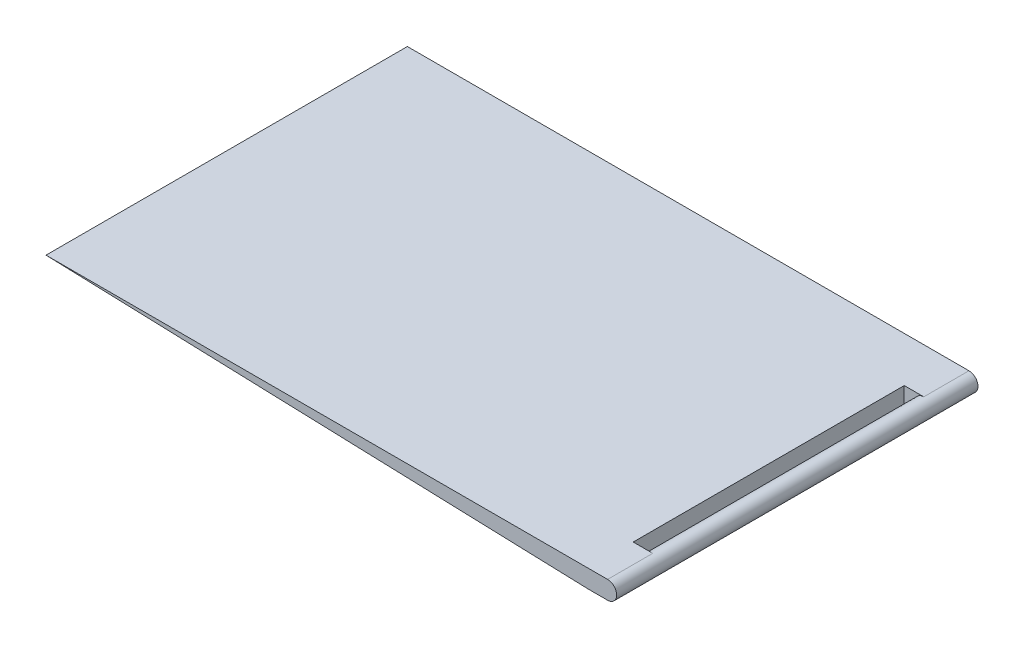
ISO-10303-21;
HEADER;
FILE_DESCRIPTION(('STEP AP214'),'2;1');
FILE_NAME('part.step','',(''),(''),'','','');
FILE_SCHEMA(('AUTOMOTIVE_DESIGN { 1 0 10303 214 1 1 1 1 }'));
ENDSEC;
DATA;
#1=APPLICATION_CONTEXT('core data for automotive mechanical design processes');
#2=APPLICATION_PROTOCOL_DEFINITION('international standard','automotive_design',2000,#1);
#3=PRODUCT_CONTEXT('',#1,'mechanical');
#4=PRODUCT('Part','Part','',(#3));
#5=PRODUCT_RELATED_PRODUCT_CATEGORY('part','',(#4));
#6=PRODUCT_DEFINITION_FORMATION('','',#4);
#7=PRODUCT_DEFINITION_CONTEXT('part definition',#1,'design');
#8=PRODUCT_DEFINITION('design','',#6,#7);
#9=PRODUCT_DEFINITION_SHAPE('','',#8);
#10=(LENGTH_UNIT() NAMED_UNIT(*) SI_UNIT(.MILLI.,.METRE.));
#11=(NAMED_UNIT(*) PLANE_ANGLE_UNIT() SI_UNIT($,.RADIAN.));
#12=(NAMED_UNIT(*) SI_UNIT($,.STERADIAN.) SOLID_ANGLE_UNIT());
#13=UNCERTAINTY_MEASURE_WITH_UNIT(LENGTH_MEASURE(1.E-05),#10,'distance_accuracy_value','');
#14=(GEOMETRIC_REPRESENTATION_CONTEXT(3) GLOBAL_UNCERTAINTY_ASSIGNED_CONTEXT((#13)) GLOBAL_UNIT_ASSIGNED_CONTEXT((#10,
#11,#12)) REPRESENTATION_CONTEXT('',''));
#15=CARTESIAN_POINT('',(0.,0.,0.));
#16=DIRECTION('',(0.,0.,1.));
#17=DIRECTION('',(1.,0.,0.));
#18=AXIS2_PLACEMENT_3D('',#15,#16,#17);
#19=CARTESIAN_POINT('',(-2.16341969170746,1.,-80.0333240792145));
#20=DIRECTION('',(1.,0.,0.));
#21=DIRECTION('',(0.,0.,-1.));
#22=AXIS2_PLACEMENT_3D('',#19,#20,#21);
#23=PLANE('',#22);
#24=DIRECTION('',(0.,0.,1.));
#25=VECTOR('',#24,1.);
#26=CARTESIAN_POINT('',(-2.16341969170746,-1.,-80.0333240792145));
#27=LINE('',#26,#25);
#28=CARTESIAN_POINT('',(-2.16341969170746,-1.,-15.));
#29=VERTEX_POINT('',#28);
#30=CARTESIAN_POINT('',(-2.16341969170746,-1.,15.));
#31=VERTEX_POINT('',#30);
#32=EDGE_CURVE('E125',#29,#31,#27,.T.);
#33=ORIENTED_EDGE('',*,*,#32,.F.);
#34=DIRECTION('',(0.,1.,0.));
#35=VECTOR('',#34,1.);
#36=CARTESIAN_POINT('',(-2.16341969170746,-1.,-15.));
#37=LINE('',#36,#35);
#38=CARTESIAN_POINT('',(-2.16341969170746,1.,-15.));
#39=VERTEX_POINT('',#38);
#40=EDGE_CURVE('E113',#29,#39,#37,.T.);
#41=ORIENTED_EDGE('',*,*,#40,.T.);
#42=DIRECTION('',(0.,0.,1.));
#43=VECTOR('',#42,1.);
#44=CARTESIAN_POINT('',(-2.16341969170746,1.,-80.0333240792145));
#45=LINE('',#44,#43);
#46=CARTESIAN_POINT('',(-2.16341969170746,1.,15.));
#47=VERTEX_POINT('',#46);
#48=EDGE_CURVE('E123',#39,#47,#45,.T.);
#49=ORIENTED_EDGE('',*,*,#48,.T.);
#50=DIRECTION('',(0.,-1.,0.));
#51=VECTOR('',#50,1.);
#52=CARTESIAN_POINT('',(-2.16341969170746,-1.,15.));
#53=LINE('',#52,#51);
#54=EDGE_CURVE('E151',#47,#31,#53,.T.);
#55=ORIENTED_EDGE('',*,*,#54,.T.);
#56=EDGE_LOOP('',(#33,#41,#49,#55));
#57=FACE_BOUND('',#56,.T.);
#58=ADVANCED_FACE('F45',(#57),#23,.T.);
#59=CARTESIAN_POINT('',(0.,0.,-20.));
#60=DIRECTION('',(0.,0.,1.));
#61=DIRECTION('',(1.,0.,0.));
#62=AXIS2_PLACEMENT_3D('',#59,#60,#61);
#63=CYLINDRICAL_SURFACE('',#62,1.);
#64=DIRECTION('',(0.,0.,-1.));
#65=VECTOR('',#64,1.);
#66=CARTESIAN_POINT('',(0.,-1.,-15.));
#67=LINE('',#66,#65);
#68=CARTESIAN_POINT('',(0.,-1.,-15.));
#69=VERTEX_POINT('',#68);
#70=CARTESIAN_POINT('',(0.,-1.,-20.));
#71=VERTEX_POINT('',#70);
#72=EDGE_CURVE('E182',#69,#71,#67,.T.);
#73=ORIENTED_EDGE('',*,*,#72,.T.);
#74=CARTESIAN_POINT('',(0.,0.,-20.));
#75=DIRECTION('',(0.,0.,1.));
#76=DIRECTION('',(1.,0.,0.));
#77=AXIS2_PLACEMENT_3D('',#74,#75,#76);
#78=CIRCLE('',#77,1.);
#79=CARTESIAN_POINT('',(0.,1.,-20.));
#80=VERTEX_POINT('',#79);
#81=EDGE_CURVE('E54',#71,#80,#78,.T.);
#82=ORIENTED_EDGE('',*,*,#81,.T.);
#83=DIRECTION('',(0.,0.,-1.));
#84=VECTOR('',#83,1.);
#85=CARTESIAN_POINT('',(0.,1.,-15.));
#86=LINE('',#85,#84);
#87=CARTESIAN_POINT('',(0.,1.,-15.));
#88=VERTEX_POINT('',#87);
#89=EDGE_CURVE('E66',#88,#80,#86,.T.);
#90=ORIENTED_EDGE('',*,*,#89,.F.);
#91=CARTESIAN_POINT('',(0.,0.,-15.));
#92=DIRECTION('',(0.,0.,-1.));
#93=DIRECTION('',(-1.,0.,0.));
#94=AXIS2_PLACEMENT_3D('',#91,#92,#93);
#95=CIRCLE('',#94,1.);
#96=EDGE_CURVE('E61',#88,#69,#95,.F.);
#97=ORIENTED_EDGE('',*,*,#96,.T.);
#98=EDGE_LOOP('',(#73,#82,#90,#97));
#99=FACE_BOUND('',#98,.T.);
#100=DIRECTION('',(0.,0.,1.));
#101=VECTOR('',#100,1.);
#102=CARTESIAN_POINT('',(0.,1.,15.));
#103=LINE('',#102,#101);
#104=CARTESIAN_POINT('',(0.,1.,15.));
#105=VERTEX_POINT('',#104);
#106=CARTESIAN_POINT('',(0.,1.,20.));
#107=VERTEX_POINT('',#106);
#108=EDGE_CURVE('E166',#105,#107,#103,.T.);
#109=ORIENTED_EDGE('',*,*,#108,.T.);
#110=CARTESIAN_POINT('',(0.,0.,20.));
#111=DIRECTION('',(0.,0.,1.));
#112=DIRECTION('',(1.,0.,0.));
#113=AXIS2_PLACEMENT_3D('',#110,#111,#112);
#114=CIRCLE('',#113,1.);
#115=CARTESIAN_POINT('',(0.,-1.,20.));
#116=VERTEX_POINT('',#115);
#117=EDGE_CURVE('E170',#116,#107,#114,.T.);
#118=ORIENTED_EDGE('',*,*,#117,.F.);
#119=DIRECTION('',(0.,0.,1.));
#120=VECTOR('',#119,1.);
#121=CARTESIAN_POINT('',(0.,-1.,15.));
#122=LINE('',#121,#120);
#123=CARTESIAN_POINT('',(0.,-1.,15.));
#124=VERTEX_POINT('',#123);
#125=EDGE_CURVE('E171',#124,#116,#122,.T.);
#126=ORIENTED_EDGE('',*,*,#125,.F.);
#127=CARTESIAN_POINT('',(0.,0.,15.));
#128=DIRECTION('',(0.,0.,-1.));
#129=DIRECTION('',(-1.,0.,0.));
#130=AXIS2_PLACEMENT_3D('',#127,#128,#129);
#131=CIRCLE('',#130,1.);
#132=EDGE_CURVE('E11',#105,#124,#131,.F.);
#133=ORIENTED_EDGE('',*,*,#132,.F.);
#134=EDGE_LOOP('',(#109,#118,#126,#133));
#135=FACE_BOUND('',#134,.T.);
#136=ADVANCED_FACE('F47',(#99,#135),#63,.T.);
#137=CARTESIAN_POINT('',(0.,0.,-20.));
#138=DIRECTION('',(0.,0.,1.));
#139=DIRECTION('',(1.,0.,0.));
#140=AXIS2_PLACEMENT_3D('',#137,#138,#139);
#141=PLANE('',#140);
#142=ORIENTED_EDGE('',*,*,#81,.F.);
#143=DIRECTION('',(-1.,0.,0.));
#144=VECTOR('',#143,1.);
#145=CARTESIAN_POINT('',(0.,-1.,-20.));
#146=LINE('',#145,#144);
#147=CARTESIAN_POINT('',(-2.16341969170746,-1.,-20.));
#148=VERTEX_POINT('',#147);
#149=EDGE_CURVE('E128',#71,#148,#146,.T.);
#150=ORIENTED_EDGE('',*,*,#149,.T.);
#151=DIRECTION('',(-0.999444906979154,0.0333148302326385,0.));
#152=VECTOR('',#151,1.);
#153=CARTESIAN_POINT('',(-2.16341969170746,-1.,-20.));
#154=LINE('',#153,#152);
#155=CARTESIAN_POINT('',(-62.1634196917075,1.,-20.));
#156=VERTEX_POINT('',#155);
#157=EDGE_CURVE('E150',#148,#156,#154,.T.);
#158=ORIENTED_EDGE('',*,*,#157,.T.);
#159=DIRECTION('',(1.,0.,0.));
#160=VECTOR('',#159,1.);
#161=CARTESIAN_POINT('',(-62.1634196917075,1.,-20.));
#162=LINE('',#161,#160);
#163=EDGE_CURVE('E146',#156,#80,#162,.T.);
#164=ORIENTED_EDGE('',*,*,#163,.T.);
#165=EDGE_LOOP('',(#142,#150,#158,#164));
#166=FACE_BOUND('',#165,.T.);
#167=ADVANCED_FACE('F218',(#166),#141,.F.);
#168=CARTESIAN_POINT('',(0.,0.,20.));
#169=DIRECTION('',(0.,0.,1.));
#170=DIRECTION('',(1.,0.,0.));
#171=AXIS2_PLACEMENT_3D('',#168,#169,#170);
#172=PLANE('',#171);
#173=ORIENTED_EDGE('',*,*,#117,.T.);
#174=DIRECTION('',(-1.,0.,0.));
#175=VECTOR('',#174,1.);
#176=CARTESIAN_POINT('',(-2.16341969170746,1.,20.));
#177=LINE('',#176,#175);
#178=CARTESIAN_POINT('',(-62.1634196917075,1.,20.));
#179=VERTEX_POINT('',#178);
#180=EDGE_CURVE('E155',#107,#179,#177,.T.);
#181=ORIENTED_EDGE('',*,*,#180,.T.);
#182=DIRECTION('',(0.999444906979154,-0.0333148302326385,0.));
#183=VECTOR('',#182,1.);
#184=CARTESIAN_POINT('',(-2.16341969170746,-1.,20.));
#185=LINE('',#184,#183);
#186=CARTESIAN_POINT('',(-2.16341969170746,-1.,20.));
#187=VERTEX_POINT('',#186);
#188=EDGE_CURVE('E136',#179,#187,#185,.T.);
#189=ORIENTED_EDGE('',*,*,#188,.T.);
#190=DIRECTION('',(1.,0.,0.));
#191=VECTOR('',#190,1.);
#192=CARTESIAN_POINT('',(0.,-1.,20.));
#193=LINE('',#192,#191);
#194=EDGE_CURVE('E149',#187,#116,#193,.T.);
#195=ORIENTED_EDGE('',*,*,#194,.T.);
#196=EDGE_LOOP('',(#173,#181,#189,#195));
#197=FACE_BOUND('',#196,.T.);
#198=ADVANCED_FACE('F215',(#197),#172,.T.);
#199=CARTESIAN_POINT('',(-2.16341969170746,1.,15.));
#200=DIRECTION('',(0.,1.,0.));
#201=DIRECTION('',(0.,0.,1.));
#202=AXIS2_PLACEMENT_3D('',#199,#200,#201);
#203=PLANE('',#202);
#204=ORIENTED_EDGE('',*,*,#180,.F.);
#205=ORIENTED_EDGE('',*,*,#108,.F.);
#206=DIRECTION('',(-1.,0.,0.));
#207=VECTOR('',#206,1.);
#208=CARTESIAN_POINT('',(-2.16341969170746,1.,15.));
#209=LINE('',#208,#207);
#210=EDGE_CURVE('E133',#105,#47,#209,.T.);
#211=ORIENTED_EDGE('',*,*,#210,.T.);
#212=ORIENTED_EDGE('',*,*,#48,.F.);
#213=DIRECTION('',(1.,0.,0.));
#214=VECTOR('',#213,1.);
#215=CARTESIAN_POINT('',(-2.16341969170746,1.,-15.));
#216=LINE('',#215,#214);
#217=EDGE_CURVE('E109',#39,#88,#216,.T.);
#218=ORIENTED_EDGE('',*,*,#217,.T.);
#219=ORIENTED_EDGE('',*,*,#89,.T.);
#220=ORIENTED_EDGE('',*,*,#163,.F.);
#221=DIRECTION('',(0.,0.,1.));
#222=VECTOR('',#221,1.);
#223=CARTESIAN_POINT('',(-62.1634196917075,1.,-80.0333240792145));
#224=LINE('',#223,#222);
#225=EDGE_CURVE('E135',#156,#179,#224,.T.);
#226=ORIENTED_EDGE('',*,*,#225,.T.);
#227=EDGE_LOOP('',(#204,#205,#211,#212,#218,#219,#220,#226));
#228=FACE_BOUND('',#227,.T.);
#229=ADVANCED_FACE('F131',(#228),#203,.T.);
#230=CARTESIAN_POINT('',(0.,-1.,15.));
#231=DIRECTION('',(0.,-1.,0.));
#232=DIRECTION('',(0.,0.,-1.));
#233=AXIS2_PLACEMENT_3D('',#230,#231,#232);
#234=PLANE('',#233);
#235=ORIENTED_EDGE('',*,*,#194,.F.);
#236=DIRECTION('',(0.,0.,1.));
#237=VECTOR('',#236,1.);
#238=CARTESIAN_POINT('',(-2.16341969170746,-1.,15.));
#239=LINE('',#238,#237);
#240=EDGE_CURVE('E161',#31,#187,#239,.T.);
#241=ORIENTED_EDGE('',*,*,#240,.F.);
#242=DIRECTION('',(1.,0.,0.));
#243=VECTOR('',#242,1.);
#244=CARTESIAN_POINT('',(0.,-1.,15.));
#245=LINE('',#244,#243);
#246=EDGE_CURVE('E154',#31,#124,#245,.T.);
#247=ORIENTED_EDGE('',*,*,#246,.T.);
#248=ORIENTED_EDGE('',*,*,#125,.T.);
#249=EDGE_LOOP('',(#235,#241,#247,#248));
#250=FACE_BOUND('',#249,.T.);
#251=ADVANCED_FACE('F212',(#250),#234,.T.);
#252=CARTESIAN_POINT('',(0.,0.,15.));
#253=DIRECTION('',(0.,0.,-1.));
#254=DIRECTION('',(-1.,0.,0.));
#255=AXIS2_PLACEMENT_3D('',#252,#253,#254);
#256=PLANE('',#255);
#257=ORIENTED_EDGE('',*,*,#210,.F.);
#258=ORIENTED_EDGE('',*,*,#132,.T.);
#259=ORIENTED_EDGE('',*,*,#246,.F.);
#260=ORIENTED_EDGE('',*,*,#54,.F.);
#261=EDGE_LOOP('',(#257,#258,#259,#260));
#262=FACE_BOUND('',#261,.T.);
#263=ADVANCED_FACE('F208',(#262),#256,.T.);
#264=CARTESIAN_POINT('',(-2.16341969170746,-1.,-80.0333240792145));
#265=DIRECTION('',(-0.0333148302326385,-0.999444906979154,0.));
#266=DIRECTION('',(0.999444906979154,-0.0333148302326385,0.));
#267=AXIS2_PLACEMENT_3D('',#264,#265,#266);
#268=PLANE('',#267);
#269=ORIENTED_EDGE('',*,*,#157,.F.);
#270=EDGE_CURVE('E197',#148,#29,#27,.T.);
#271=ORIENTED_EDGE('',*,*,#270,.T.);
#272=ORIENTED_EDGE('',*,*,#32,.T.);
#273=ORIENTED_EDGE('',*,*,#240,.T.);
#274=ORIENTED_EDGE('',*,*,#188,.F.);
#275=ORIENTED_EDGE('',*,*,#225,.F.);
#276=EDGE_LOOP('',(#269,#271,#272,#273,#274,#275));
#277=FACE_BOUND('',#276,.T.);
#278=ADVANCED_FACE('F204',(#277),#268,.T.);
#279=CARTESIAN_POINT('',(0.,-1.,-15.));
#280=DIRECTION('',(0.,-1.,0.));
#281=DIRECTION('',(0.,0.,-1.));
#282=AXIS2_PLACEMENT_3D('',#279,#280,#281);
#283=PLANE('',#282);
#284=ORIENTED_EDGE('',*,*,#149,.F.);
#285=ORIENTED_EDGE('',*,*,#72,.F.);
#286=DIRECTION('',(-1.,0.,0.));
#287=VECTOR('',#286,1.);
#288=CARTESIAN_POINT('',(0.,-1.,-15.));
#289=LINE('',#288,#287);
#290=EDGE_CURVE('E118',#69,#29,#289,.T.);
#291=ORIENTED_EDGE('',*,*,#290,.T.);
#292=ORIENTED_EDGE('',*,*,#270,.F.);
#293=EDGE_LOOP('',(#284,#285,#291,#292));
#294=FACE_BOUND('',#293,.T.);
#295=ADVANCED_FACE('F279',(#294),#283,.T.);
#296=CARTESIAN_POINT('',(0.,0.,-15.));
#297=DIRECTION('',(0.,0.,-1.));
#298=DIRECTION('',(-1.,0.,0.));
#299=AXIS2_PLACEMENT_3D('',#296,#297,#298);
#300=PLANE('',#299);
#301=ORIENTED_EDGE('',*,*,#96,.F.);
#302=ORIENTED_EDGE('',*,*,#217,.F.);
#303=ORIENTED_EDGE('',*,*,#40,.F.);
#304=ORIENTED_EDGE('',*,*,#290,.F.);
#305=EDGE_LOOP('',(#301,#302,#303,#304));
#306=FACE_BOUND('',#305,.T.);
#307=ADVANCED_FACE('F111',(#306),#300,.F.);
#308=CLOSED_SHELL('',(#58,#136,#167,#198,#229,#251,#263,#278,#295,#307));
#309=MANIFOLD_SOLID_BREP('B2',#308);
#310=ADVANCED_BREP_SHAPE_REPRESENTATION('',(#18,#309),#14);
#311=SHAPE_DEFINITION_REPRESENTATION(#9,#310);
ENDSEC;
END-ISO-10303-21;
